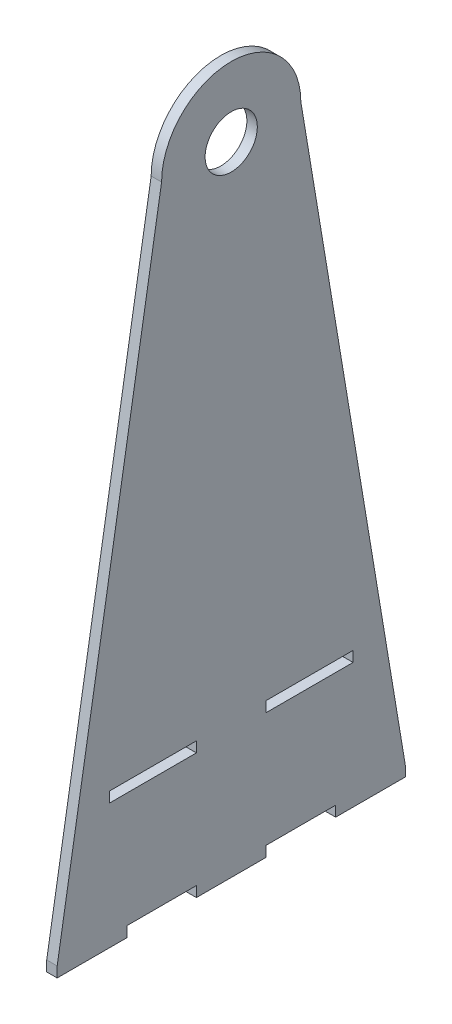
ISO-10303-21;
HEADER;
FILE_DESCRIPTION(('STEP AP214'),'2;1');
FILE_NAME('part.step','',(''),(''),'','','');
FILE_SCHEMA(('AUTOMOTIVE_DESIGN { 1 0 10303 214 1 1 1 1 }'));
ENDSEC;
DATA;
#1=APPLICATION_CONTEXT('core data for automotive mechanical design processes');
#2=APPLICATION_PROTOCOL_DEFINITION('international standard','automotive_design',2000,#1);
#3=PRODUCT_CONTEXT('',#1,'mechanical');
#4=PRODUCT('Part','Part','',(#3));
#5=PRODUCT_RELATED_PRODUCT_CATEGORY('part','',(#4));
#6=PRODUCT_DEFINITION_FORMATION('','',#4);
#7=PRODUCT_DEFINITION_CONTEXT('part definition',#1,'design');
#8=PRODUCT_DEFINITION('design','',#6,#7);
#9=PRODUCT_DEFINITION_SHAPE('','',#8);
#10=(LENGTH_UNIT() NAMED_UNIT(*) SI_UNIT(.MILLI.,.METRE.));
#11=(NAMED_UNIT(*) PLANE_ANGLE_UNIT() SI_UNIT($,.RADIAN.));
#12=(NAMED_UNIT(*) SI_UNIT($,.STERADIAN.) SOLID_ANGLE_UNIT());
#13=UNCERTAINTY_MEASURE_WITH_UNIT(LENGTH_MEASURE(1.E-05),#10,'distance_accuracy_value','');
#14=(GEOMETRIC_REPRESENTATION_CONTEXT(3) GLOBAL_UNCERTAINTY_ASSIGNED_CONTEXT((#13)) GLOBAL_UNIT_ASSIGNED_CONTEXT((#10,
#11,#12)) REPRESENTATION_CONTEXT('',''));
#15=CARTESIAN_POINT('',(0.,0.,0.));
#16=DIRECTION('',(0.,0.,1.));
#17=DIRECTION('',(1.,0.,0.));
#18=AXIS2_PLACEMENT_3D('',#15,#16,#17);
#19=CARTESIAN_POINT('',(1.5,0.,-50.));
#20=DIRECTION('',(0.,1.,0.));
#21=DIRECTION('',(0.,0.,1.));
#22=AXIS2_PLACEMENT_3D('',#19,#20,#21);
#23=PLANE('',#22);
#24=DIRECTION('',(1.,0.,0.));
#25=VECTOR('',#24,1.);
#26=CARTESIAN_POINT('',(-1.5,0.,30.));
#27=LINE('',#26,#25);
#28=CARTESIAN_POINT('',(-1.5,0.,30.));
#29=VERTEX_POINT('',#28);
#30=CARTESIAN_POINT('',(1.5,0.,30.));
#31=VERTEX_POINT('',#30);
#32=EDGE_CURVE('E54',#29,#31,#27,.T.);
#33=ORIENTED_EDGE('',*,*,#32,.F.);
#34=DIRECTION('',(0.,0.,-1.));
#35=VECTOR('',#34,1.);
#36=CARTESIAN_POINT('',(-1.5,0.,-50.));
#37=LINE('',#36,#35);
#38=CARTESIAN_POINT('',(-1.5,0.,10.));
#39=VERTEX_POINT('',#38);
#40=EDGE_CURVE('E215',#29,#39,#37,.T.);
#41=ORIENTED_EDGE('',*,*,#40,.T.);
#42=DIRECTION('',(-1.,0.,0.));
#43=VECTOR('',#42,1.);
#44=CARTESIAN_POINT('',(0.,0.,10.));
#45=LINE('',#44,#43);
#46=CARTESIAN_POINT('',(1.5,0.,10.));
#47=VERTEX_POINT('',#46);
#48=EDGE_CURVE('E311',#47,#39,#45,.T.);
#49=ORIENTED_EDGE('',*,*,#48,.F.);
#50=DIRECTION('',(0.,0.,-1.));
#51=VECTOR('',#50,1.);
#52=CARTESIAN_POINT('',(1.5,0.,-50.));
#53=LINE('',#52,#51);
#54=EDGE_CURVE('E50',#31,#47,#53,.T.);
#55=ORIENTED_EDGE('',*,*,#54,.F.);
#56=EDGE_LOOP('',(#33,#41,#49,#55));
#57=FACE_BOUND('',#56,.T.);
#58=ADVANCED_FACE('F35',(#57),#23,.F.);
#59=DIRECTION('',(-1.,0.,0.));
#60=VECTOR('',#59,1.);
#61=CARTESIAN_POINT('',(0.,0.,-30.));
#62=LINE('',#61,#60);
#63=CARTESIAN_POINT('',(1.5,0.,-30.));
#64=VERTEX_POINT('',#63);
#65=CARTESIAN_POINT('',(-1.5,0.,-30.));
#66=VERTEX_POINT('',#65);
#67=EDGE_CURVE('E314',#64,#66,#62,.T.);
#68=ORIENTED_EDGE('',*,*,#67,.F.);
#69=CARTESIAN_POINT('',(1.5,0.,-9.99999999999999));
#70=VERTEX_POINT('',#69);
#71=EDGE_CURVE('E224',#70,#64,#53,.T.);
#72=ORIENTED_EDGE('',*,*,#71,.F.);
#73=DIRECTION('',(1.,0.,0.));
#74=VECTOR('',#73,1.);
#75=CARTESIAN_POINT('',(0.,0.,-10.));
#76=LINE('',#75,#74);
#77=CARTESIAN_POINT('',(-1.5,0.,-9.99999999999999));
#78=VERTEX_POINT('',#77);
#79=EDGE_CURVE('E307',#78,#70,#76,.T.);
#80=ORIENTED_EDGE('',*,*,#79,.F.);
#81=EDGE_CURVE('E192',#78,#66,#37,.T.);
#82=ORIENTED_EDGE('',*,*,#81,.T.);
#83=EDGE_LOOP('',(#68,#72,#80,#82));
#84=FACE_BOUND('',#83,.T.);
#85=ADVANCED_FACE('F379',(#84),#23,.F.);
#86=CARTESIAN_POINT('',(1.5,180.,0.));
#87=DIRECTION('',(1.,0.,0.));
#88=DIRECTION('',(0.,0.,-1.));
#89=AXIS2_PLACEMENT_3D('',#86,#87,#88);
#90=PLANE('',#89);
#91=DIRECTION('',(0.,-1.,0.));
#92=VECTOR('',#91,1.);
#93=CARTESIAN_POINT('',(1.5,180.,-10.));
#94=LINE('',#93,#92);
#95=CARTESIAN_POINT('',(1.5,36.,-10.));
#96=VERTEX_POINT('',#95);
#97=CARTESIAN_POINT('',(1.5,33.,-10.));
#98=VERTEX_POINT('',#97);
#99=EDGE_CURVE('E234',#96,#98,#94,.T.);
#100=ORIENTED_EDGE('',*,*,#99,.F.);
#101=DIRECTION('',(0.,0.,1.));
#102=VECTOR('',#101,1.);
#103=CARTESIAN_POINT('',(1.5,36.,0.));
#104=LINE('',#103,#102);
#105=CARTESIAN_POINT('',(1.5,36.,-35.));
#106=VERTEX_POINT('',#105);
#107=EDGE_CURVE('E243',#106,#96,#104,.T.);
#108=ORIENTED_EDGE('',*,*,#107,.F.);
#109=DIRECTION('',(0.,1.,0.));
#110=VECTOR('',#109,1.);
#111=CARTESIAN_POINT('',(1.5,180.,-35.));
#112=LINE('',#111,#110);
#113=CARTESIAN_POINT('',(1.5,33.,-35.));
#114=VERTEX_POINT('',#113);
#115=EDGE_CURVE('E240',#114,#106,#112,.T.);
#116=ORIENTED_EDGE('',*,*,#115,.F.);
#117=DIRECTION('',(0.,0.,-1.));
#118=VECTOR('',#117,1.);
#119=CARTESIAN_POINT('',(1.5,33.,0.));
#120=LINE('',#119,#118);
#121=EDGE_CURVE('E238',#98,#114,#120,.T.);
#122=ORIENTED_EDGE('',*,*,#121,.F.);
#123=EDGE_LOOP('',(#100,#108,#116,#122));
#124=FACE_BOUND('',#123,.T.);
#125=DIRECTION('',(0.,0.,1.));
#126=VECTOR('',#125,1.);
#127=CARTESIAN_POINT('',(1.5,36.,0.));
#128=LINE('',#127,#126);
#129=CARTESIAN_POINT('',(1.5,36.,10.));
#130=VERTEX_POINT('',#129);
#131=CARTESIAN_POINT('',(1.5,36.,35.));
#132=VERTEX_POINT('',#131);
#133=EDGE_CURVE('E245',#130,#132,#128,.T.);
#134=ORIENTED_EDGE('',*,*,#133,.F.);
#135=DIRECTION('',(0.,1.,0.));
#136=VECTOR('',#135,1.);
#137=CARTESIAN_POINT('',(1.5,180.,10.));
#138=LINE('',#137,#136);
#139=CARTESIAN_POINT('',(1.5,33.,10.));
#140=VERTEX_POINT('',#139);
#141=EDGE_CURVE('E252',#140,#130,#138,.T.);
#142=ORIENTED_EDGE('',*,*,#141,.F.);
#143=DIRECTION('',(0.,0.,-1.));
#144=VECTOR('',#143,1.);
#145=CARTESIAN_POINT('',(1.5,33.,0.));
#146=LINE('',#145,#144);
#147=CARTESIAN_POINT('',(1.5,33.,35.));
#148=VERTEX_POINT('',#147);
#149=EDGE_CURVE('E249',#148,#140,#146,.T.);
#150=ORIENTED_EDGE('',*,*,#149,.F.);
#151=DIRECTION('',(0.,-1.,0.));
#152=VECTOR('',#151,1.);
#153=CARTESIAN_POINT('',(1.5,180.,35.));
#154=LINE('',#153,#152);
#155=EDGE_CURVE('E247',#132,#148,#154,.T.);
#156=ORIENTED_EDGE('',*,*,#155,.F.);
#157=EDGE_LOOP('',(#134,#142,#150,#156));
#158=FACE_BOUND('',#157,.T.);
#159=DIRECTION('',(0.,0.986393923832144,0.164398987305357));
#160=VECTOR('',#159,1.);
#161=CARTESIAN_POINT('',(1.5,0.,-50.));
#162=LINE('',#161,#160);
#163=CARTESIAN_POINT('',(1.5,0.,-50.));
#164=VERTEX_POINT('',#163);
#165=CARTESIAN_POINT('',(1.5,180.,-20.));
#166=VERTEX_POINT('',#165);
#167=EDGE_CURVE('E216',#164,#166,#162,.T.);
#168=ORIENTED_EDGE('',*,*,#167,.T.);
#169=CARTESIAN_POINT('',(1.5,180.,0.));
#170=DIRECTION('',(1.,0.,0.));
#171=DIRECTION('',(0.,0.,-1.));
#172=AXIS2_PLACEMENT_3D('',#169,#170,#171);
#173=CIRCLE('',#172,20.);
#174=CARTESIAN_POINT('',(1.5,180.,20.));
#175=VERTEX_POINT('',#174);
#176=EDGE_CURVE('E227',#166,#175,#173,.T.);
#177=ORIENTED_EDGE('',*,*,#176,.T.);
#178=DIRECTION('',(0.,-0.986393923832144,0.164398987305357));
#179=VECTOR('',#178,1.);
#180=CARTESIAN_POINT('',(1.5,0.,50.));
#181=LINE('',#180,#179);
#182=CARTESIAN_POINT('',(1.5,0.,50.));
#183=VERTEX_POINT('',#182);
#184=EDGE_CURVE('E225',#175,#183,#181,.T.);
#185=ORIENTED_EDGE('',*,*,#184,.T.);
#186=DIRECTION('',(0.,1.,0.));
#187=VECTOR('',#186,1.);
#188=CARTESIAN_POINT('',(1.5,-3.00000000000001,50.));
#189=LINE('',#188,#187);
#190=CARTESIAN_POINT('',(1.5,-3.00000000000001,50.));
#191=VERTEX_POINT('',#190);
#192=EDGE_CURVE('E209',#191,#183,#189,.T.);
#193=ORIENTED_EDGE('',*,*,#192,.F.);
#194=DIRECTION('',(0.,0.,1.));
#195=VECTOR('',#194,1.);
#196=CARTESIAN_POINT('',(1.5,-3.,30.));
#197=LINE('',#196,#195);
#198=CARTESIAN_POINT('',(1.5,-3.,30.));
#199=VERTEX_POINT('',#198);
#200=EDGE_CURVE('E347',#199,#191,#197,.T.);
#201=ORIENTED_EDGE('',*,*,#200,.F.);
#202=DIRECTION('',(0.,1.,0.));
#203=VECTOR('',#202,1.);
#204=CARTESIAN_POINT('',(1.5,-3.,30.));
#205=LINE('',#204,#203);
#206=EDGE_CURVE('E351',#199,#31,#205,.T.);
#207=ORIENTED_EDGE('',*,*,#206,.T.);
#208=ORIENTED_EDGE('',*,*,#54,.T.);
#209=DIRECTION('',(0.,1.,0.));
#210=VECTOR('',#209,1.);
#211=CARTESIAN_POINT('',(1.5,-3.,10.));
#212=LINE('',#211,#210);
#213=CARTESIAN_POINT('',(1.5,-3.,10.));
#214=VERTEX_POINT('',#213);
#215=EDGE_CURVE('E276',#214,#47,#212,.T.);
#216=ORIENTED_EDGE('',*,*,#215,.F.);
#217=DIRECTION('',(0.,0.,1.));
#218=VECTOR('',#217,1.);
#219=CARTESIAN_POINT('',(1.5,-3.,0.));
#220=LINE('',#219,#218);
#221=CARTESIAN_POINT('',(1.5,-3.,-10.));
#222=VERTEX_POINT('',#221);
#223=EDGE_CURVE('E310',#222,#214,#220,.T.);
#224=ORIENTED_EDGE('',*,*,#223,.F.);
#225=DIRECTION('',(0.,1.,0.));
#226=VECTOR('',#225,1.);
#227=CARTESIAN_POINT('',(1.5,-3.,-10.));
#228=LINE('',#227,#226);
#229=EDGE_CURVE('E303',#222,#70,#228,.T.);
#230=ORIENTED_EDGE('',*,*,#229,.T.);
#231=ORIENTED_EDGE('',*,*,#71,.T.);
#232=DIRECTION('',(0.,1.,0.));
#233=VECTOR('',#232,1.);
#234=CARTESIAN_POINT('',(1.5,-3.,-30.));
#235=LINE('',#234,#233);
#236=CARTESIAN_POINT('',(1.5,-3.,-30.));
#237=VERTEX_POINT('',#236);
#238=EDGE_CURVE('E340',#237,#64,#235,.T.);
#239=ORIENTED_EDGE('',*,*,#238,.F.);
#240=DIRECTION('',(0.,0.,1.));
#241=VECTOR('',#240,1.);
#242=CARTESIAN_POINT('',(1.5,-3.,0.));
#243=LINE('',#242,#241);
#244=CARTESIAN_POINT('',(1.5,-2.99999999999999,-50.));
#245=VERTEX_POINT('',#244);
#246=EDGE_CURVE('E322',#245,#237,#243,.T.);
#247=ORIENTED_EDGE('',*,*,#246,.F.);
#248=DIRECTION('',(0.,1.,0.));
#249=VECTOR('',#248,1.);
#250=CARTESIAN_POINT('',(1.5,-2.99999999999999,-50.));
#251=LINE('',#250,#249);
#252=EDGE_CURVE('E331',#245,#164,#251,.T.);
#253=ORIENTED_EDGE('',*,*,#252,.T.);
#254=EDGE_LOOP('',(#168,#177,#185,#193,#201,#207,#208,#216,#224,#230,#231,#239,#247,#253));
#255=FACE_BOUND('',#254,.T.);
#256=CARTESIAN_POINT('',(1.5,180.,0.));
#257=DIRECTION('',(1.,0.,0.));
#258=DIRECTION('',(0.,0.,-1.));
#259=AXIS2_PLACEMENT_3D('',#256,#257,#258);
#260=CIRCLE('',#259,7.5);
#261=CARTESIAN_POINT('',(1.5,180.,-7.5));
#262=VERTEX_POINT('',#261);
#263=EDGE_CURVE('E222',#262,#262,#260,.T.);
#264=ORIENTED_EDGE('',*,*,#263,.F.);
#265=EDGE_LOOP('',(#264));
#266=FACE_BOUND('',#265,.T.);
#267=ADVANCED_FACE('F366',(#124,#158,#255,#266),#90,.T.);
#268=CARTESIAN_POINT('',(-1.5,180.,0.));
#269=DIRECTION('',(1.,0.,0.));
#270=DIRECTION('',(0.,0.,-1.));
#271=AXIS2_PLACEMENT_3D('',#268,#269,#270);
#272=PLANE('',#271);
#273=DIRECTION('',(0.,0.,-1.));
#274=VECTOR('',#273,1.);
#275=CARTESIAN_POINT('',(-1.5,36.,-10.));
#276=LINE('',#275,#274);
#277=CARTESIAN_POINT('',(-1.5,36.,-10.));
#278=VERTEX_POINT('',#277);
#279=CARTESIAN_POINT('',(-1.5,36.,-35.));
#280=VERTEX_POINT('',#279);
#281=EDGE_CURVE('E291',#278,#280,#276,.T.);
#282=ORIENTED_EDGE('',*,*,#281,.F.);
#283=DIRECTION('',(0.,1.,0.));
#284=VECTOR('',#283,1.);
#285=CARTESIAN_POINT('',(-1.5,36.,-10.));
#286=LINE('',#285,#284);
#287=CARTESIAN_POINT('',(-1.5,33.,-10.));
#288=VERTEX_POINT('',#287);
#289=EDGE_CURVE('E265',#288,#278,#286,.T.);
#290=ORIENTED_EDGE('',*,*,#289,.F.);
#291=DIRECTION('',(0.,0.,1.));
#292=VECTOR('',#291,1.);
#293=CARTESIAN_POINT('',(-1.5,33.,-10.));
#294=LINE('',#293,#292);
#295=CARTESIAN_POINT('',(-1.5,33.,-35.));
#296=VERTEX_POINT('',#295);
#297=EDGE_CURVE('E281',#296,#288,#294,.T.);
#298=ORIENTED_EDGE('',*,*,#297,.F.);
#299=DIRECTION('',(0.,-1.,0.));
#300=VECTOR('',#299,1.);
#301=CARTESIAN_POINT('',(-1.5,36.,-35.));
#302=LINE('',#301,#300);
#303=EDGE_CURVE('E288',#280,#296,#302,.T.);
#304=ORIENTED_EDGE('',*,*,#303,.F.);
#305=EDGE_LOOP('',(#282,#290,#298,#304));
#306=FACE_BOUND('',#305,.T.);
#307=DIRECTION('',(0.,-1.,0.));
#308=VECTOR('',#307,1.);
#309=CARTESIAN_POINT('',(-1.5,36.,10.));
#310=LINE('',#309,#308);
#311=CARTESIAN_POINT('',(-1.5,36.,10.));
#312=VERTEX_POINT('',#311);
#313=CARTESIAN_POINT('',(-1.5,33.,10.));
#314=VERTEX_POINT('',#313);
#315=EDGE_CURVE('E271',#312,#314,#310,.T.);
#316=ORIENTED_EDGE('',*,*,#315,.F.);
#317=DIRECTION('',(0.,0.,-1.));
#318=VECTOR('',#317,1.);
#319=CARTESIAN_POINT('',(-1.5,36.,10.));
#320=LINE('',#319,#318);
#321=CARTESIAN_POINT('',(-1.5,36.,35.));
#322=VERTEX_POINT('',#321);
#323=EDGE_CURVE('E274',#322,#312,#320,.T.);
#324=ORIENTED_EDGE('',*,*,#323,.F.);
#325=DIRECTION('',(0.,1.,0.));
#326=VECTOR('',#325,1.);
#327=CARTESIAN_POINT('',(-1.5,36.,35.));
#328=LINE('',#327,#326);
#329=CARTESIAN_POINT('',(-1.5,33.,35.));
#330=VERTEX_POINT('',#329);
#331=EDGE_CURVE('E259',#330,#322,#328,.T.);
#332=ORIENTED_EDGE('',*,*,#331,.F.);
#333=DIRECTION('',(0.,0.,1.));
#334=VECTOR('',#333,1.);
#335=CARTESIAN_POINT('',(-1.5,33.,10.));
#336=LINE('',#335,#334);
#337=EDGE_CURVE('E268',#314,#330,#336,.T.);
#338=ORIENTED_EDGE('',*,*,#337,.F.);
#339=EDGE_LOOP('',(#316,#324,#332,#338));
#340=FACE_BOUND('',#339,.T.);
#341=DIRECTION('',(0.,0.986393923832144,0.164398987305357));
#342=VECTOR('',#341,1.);
#343=CARTESIAN_POINT('',(-1.5,0.,-50.));
#344=LINE('',#343,#342);
#345=CARTESIAN_POINT('',(-1.5,0.,-50.));
#346=VERTEX_POINT('',#345);
#347=CARTESIAN_POINT('',(-1.5,180.,-20.));
#348=VERTEX_POINT('',#347);
#349=EDGE_CURVE('E219',#346,#348,#344,.T.);
#350=ORIENTED_EDGE('',*,*,#349,.F.);
#351=DIRECTION('',(0.,1.,0.));
#352=VECTOR('',#351,1.);
#353=CARTESIAN_POINT('',(-1.5,-2.99999999999999,-50.));
#354=LINE('',#353,#352);
#355=CARTESIAN_POINT('',(-1.5,-2.99999999999999,-50.));
#356=VERTEX_POINT('',#355);
#357=EDGE_CURVE('E335',#356,#346,#354,.T.);
#358=ORIENTED_EDGE('',*,*,#357,.F.);
#359=DIRECTION('',(0.,0.,-1.));
#360=VECTOR('',#359,1.);
#361=CARTESIAN_POINT('',(-1.5,-3.,0.));
#362=LINE('',#361,#360);
#363=CARTESIAN_POINT('',(-1.5,-3.,-30.));
#364=VERTEX_POINT('',#363);
#365=EDGE_CURVE('E327',#364,#356,#362,.T.);
#366=ORIENTED_EDGE('',*,*,#365,.F.);
#367=DIRECTION('',(0.,1.,0.));
#368=VECTOR('',#367,1.);
#369=CARTESIAN_POINT('',(-1.5,-3.,-30.));
#370=LINE('',#369,#368);
#371=EDGE_CURVE('E337',#364,#66,#370,.T.);
#372=ORIENTED_EDGE('',*,*,#371,.T.);
#373=ORIENTED_EDGE('',*,*,#81,.F.);
#374=DIRECTION('',(0.,1.,0.));
#375=VECTOR('',#374,1.);
#376=CARTESIAN_POINT('',(-1.5,-3.,-10.));
#377=LINE('',#376,#375);
#378=CARTESIAN_POINT('',(-1.5,-3.,-10.));
#379=VERTEX_POINT('',#378);
#380=EDGE_CURVE('E300',#379,#78,#377,.T.);
#381=ORIENTED_EDGE('',*,*,#380,.F.);
#382=DIRECTION('',(0.,0.,-1.));
#383=VECTOR('',#382,1.);
#384=CARTESIAN_POINT('',(-1.5,-3.,0.));
#385=LINE('',#384,#383);
#386=CARTESIAN_POINT('',(-1.5,-3.,10.));
#387=VERTEX_POINT('',#386);
#388=EDGE_CURVE('E316',#387,#379,#385,.T.);
#389=ORIENTED_EDGE('',*,*,#388,.F.);
#390=DIRECTION('',(0.,1.,0.));
#391=VECTOR('',#390,1.);
#392=CARTESIAN_POINT('',(-1.5,-3.,10.));
#393=LINE('',#392,#391);
#394=EDGE_CURVE('E297',#387,#39,#393,.T.);
#395=ORIENTED_EDGE('',*,*,#394,.T.);
#396=ORIENTED_EDGE('',*,*,#40,.F.);
#397=DIRECTION('',(0.,1.,0.));
#398=VECTOR('',#397,1.);
#399=CARTESIAN_POINT('',(-1.5,-3.,30.));
#400=LINE('',#399,#398);
#401=CARTESIAN_POINT('',(-1.5,-3.,30.));
#402=VERTEX_POINT('',#401);
#403=EDGE_CURVE('E205',#402,#29,#400,.T.);
#404=ORIENTED_EDGE('',*,*,#403,.F.);
#405=DIRECTION('',(0.,0.,-1.));
#406=VECTOR('',#405,1.);
#407=CARTESIAN_POINT('',(-1.5,-3.00000000000001,50.));
#408=LINE('',#407,#406);
#409=CARTESIAN_POINT('',(-1.5,-3.00000000000001,50.));
#410=VERTEX_POINT('',#409);
#411=EDGE_CURVE('E201',#410,#402,#408,.T.);
#412=ORIENTED_EDGE('',*,*,#411,.F.);
#413=DIRECTION('',(0.,1.,0.));
#414=VECTOR('',#413,1.);
#415=CARTESIAN_POINT('',(-1.5,-3.00000000000001,50.));
#416=LINE('',#415,#414);
#417=CARTESIAN_POINT('',(-1.5,0.,50.));
#418=VERTEX_POINT('',#417);
#419=EDGE_CURVE('E196',#410,#418,#416,.T.);
#420=ORIENTED_EDGE('',*,*,#419,.T.);
#421=DIRECTION('',(0.,-0.986393923832144,0.164398987305357));
#422=VECTOR('',#421,1.);
#423=CARTESIAN_POINT('',(-1.5,0.,50.));
#424=LINE('',#423,#422);
#425=CARTESIAN_POINT('',(-1.5,180.,20.));
#426=VERTEX_POINT('',#425);
#427=EDGE_CURVE('E183',#426,#418,#424,.T.);
#428=ORIENTED_EDGE('',*,*,#427,.F.);
#429=CARTESIAN_POINT('',(-1.5,180.,0.));
#430=DIRECTION('',(1.,0.,0.));
#431=DIRECTION('',(0.,0.,-1.));
#432=AXIS2_PLACEMENT_3D('',#429,#430,#431);
#433=CIRCLE('',#432,20.);
#434=EDGE_CURVE('E193',#348,#426,#433,.T.);
#435=ORIENTED_EDGE('',*,*,#434,.F.);
#436=EDGE_LOOP('',(#350,#358,#366,#372,#373,#381,#389,#395,#396,#404,#412,#420,#428,#435));
#437=FACE_BOUND('',#436,.T.);
#438=CARTESIAN_POINT('',(-1.5,180.,0.));
#439=DIRECTION('',(1.,0.,0.));
#440=DIRECTION('',(0.,0.,-1.));
#441=AXIS2_PLACEMENT_3D('',#438,#439,#440);
#442=CIRCLE('',#441,7.5);
#443=CARTESIAN_POINT('',(-1.5,180.,-7.5));
#444=VERTEX_POINT('',#443);
#445=EDGE_CURVE('E231',#444,#444,#442,.T.);
#446=ORIENTED_EDGE('',*,*,#445,.T.);
#447=EDGE_LOOP('',(#446));
#448=FACE_BOUND('',#447,.T.);
#449=ADVANCED_FACE('F198',(#306,#340,#437,#448),#272,.F.);
#450=CARTESIAN_POINT('',(1.5,0.,-50.));
#451=DIRECTION('',(0.,-0.164398987305357,0.986393923832144));
#452=DIRECTION('',(0.,-0.986393923832144,-0.164398987305357));
#453=AXIS2_PLACEMENT_3D('',#450,#451,#452);
#454=PLANE('',#453);
#455=ORIENTED_EDGE('',*,*,#349,.T.);
#456=DIRECTION('',(-1.,0.,0.));
#457=VECTOR('',#456,1.);
#458=CARTESIAN_POINT('',(1.5,180.,-20.));
#459=LINE('',#458,#457);
#460=EDGE_CURVE('E11',#166,#348,#459,.T.);
#461=ORIENTED_EDGE('',*,*,#460,.F.);
#462=ORIENTED_EDGE('',*,*,#167,.F.);
#463=DIRECTION('',(-1.,0.,0.));
#464=VECTOR('',#463,1.);
#465=CARTESIAN_POINT('',(1.5,0.,-50.));
#466=LINE('',#465,#464);
#467=EDGE_CURVE('E210',#164,#346,#466,.T.);
#468=ORIENTED_EDGE('',*,*,#467,.T.);
#469=EDGE_LOOP('',(#455,#461,#462,#468));
#470=FACE_BOUND('',#469,.T.);
#471=ADVANCED_FACE('F37',(#470),#454,.F.);
#472=CARTESIAN_POINT('',(1.5,180.,0.));
#473=DIRECTION('',(-1.,0.,0.));
#474=DIRECTION('',(0.,0.,1.));
#475=AXIS2_PLACEMENT_3D('',#472,#473,#474);
#476=CYLINDRICAL_SURFACE('',#475,20.);
#477=ORIENTED_EDGE('',*,*,#434,.T.);
#478=DIRECTION('',(-1.,0.,0.));
#479=VECTOR('',#478,1.);
#480=CARTESIAN_POINT('',(1.5,180.,20.));
#481=LINE('',#480,#479);
#482=EDGE_CURVE('E43',#175,#426,#481,.T.);
#483=ORIENTED_EDGE('',*,*,#482,.F.);
#484=ORIENTED_EDGE('',*,*,#176,.F.);
#485=ORIENTED_EDGE('',*,*,#460,.T.);
#486=EDGE_LOOP('',(#477,#483,#484,#485));
#487=FACE_BOUND('',#486,.T.);
#488=ADVANCED_FACE('F390',(#487),#476,.T.);
#489=CARTESIAN_POINT('',(1.5,0.,50.));
#490=DIRECTION('',(0.,-0.164398987305357,-0.986393923832144));
#491=DIRECTION('',(0.,0.986393923832144,-0.164398987305357));
#492=AXIS2_PLACEMENT_3D('',#489,#490,#491);
#493=PLANE('',#492);
#494=ORIENTED_EDGE('',*,*,#427,.T.);
#495=DIRECTION('',(-1.,0.,0.));
#496=VECTOR('',#495,1.);
#497=CARTESIAN_POINT('',(1.5,0.,50.));
#498=LINE('',#497,#496);
#499=EDGE_CURVE('E188',#183,#418,#498,.T.);
#500=ORIENTED_EDGE('',*,*,#499,.F.);
#501=ORIENTED_EDGE('',*,*,#184,.F.);
#502=ORIENTED_EDGE('',*,*,#482,.T.);
#503=EDGE_LOOP('',(#494,#500,#501,#502));
#504=FACE_BOUND('',#503,.T.);
#505=ADVANCED_FACE('F185',(#504),#493,.F.);
#506=CARTESIAN_POINT('',(1.5,180.,0.));
#507=DIRECTION('',(-1.,0.,0.));
#508=DIRECTION('',(0.,0.,1.));
#509=AXIS2_PLACEMENT_3D('',#506,#507,#508);
#510=CYLINDRICAL_SURFACE('',#509,7.5);
#511=ORIENTED_EDGE('',*,*,#263,.T.);
#512=EDGE_LOOP('',(#511));
#513=FACE_BOUND('',#512,.T.);
#514=ORIENTED_EDGE('',*,*,#445,.F.);
#515=EDGE_LOOP('',(#514));
#516=FACE_BOUND('',#515,.T.);
#517=ADVANCED_FACE('F389',(#513,#516),#510,.F.);
#518=CARTESIAN_POINT('',(2.5,36.,10.));
#519=DIRECTION('',(0.,1.,0.));
#520=DIRECTION('',(0.,0.,1.));
#521=AXIS2_PLACEMENT_3D('',#518,#519,#520);
#522=PLANE('',#521);
#523=ORIENTED_EDGE('',*,*,#133,.T.);
#524=DIRECTION('',(-1.,0.,0.));
#525=VECTOR('',#524,1.);
#526=CARTESIAN_POINT('',(2.5,36.,35.));
#527=LINE('',#526,#525);
#528=EDGE_CURVE('E263',#132,#322,#527,.T.);
#529=ORIENTED_EDGE('',*,*,#528,.T.);
#530=ORIENTED_EDGE('',*,*,#323,.T.);
#531=DIRECTION('',(-1.,0.,0.));
#532=VECTOR('',#531,1.);
#533=CARTESIAN_POINT('',(2.5,36.,10.));
#534=LINE('',#533,#532);
#535=EDGE_CURVE('E255',#130,#312,#534,.T.);
#536=ORIENTED_EDGE('',*,*,#535,.F.);
#537=EDGE_LOOP('',(#523,#529,#530,#536));
#538=FACE_BOUND('',#537,.T.);
#539=ADVANCED_FACE('F456',(#538),#522,.F.);
#540=CARTESIAN_POINT('',(2.5,36.,35.));
#541=DIRECTION('',(0.,0.,1.));
#542=DIRECTION('',(1.,0.,0.));
#543=AXIS2_PLACEMENT_3D('',#540,#541,#542);
#544=PLANE('',#543);
#545=ORIENTED_EDGE('',*,*,#155,.T.);
#546=DIRECTION('',(-1.,0.,0.));
#547=VECTOR('',#546,1.);
#548=CARTESIAN_POINT('',(2.5,33.,35.));
#549=LINE('',#548,#547);
#550=EDGE_CURVE('E261',#148,#330,#549,.T.);
#551=ORIENTED_EDGE('',*,*,#550,.T.);
#552=ORIENTED_EDGE('',*,*,#331,.T.);
#553=ORIENTED_EDGE('',*,*,#528,.F.);
#554=EDGE_LOOP('',(#545,#551,#552,#553));
#555=FACE_BOUND('',#554,.T.);
#556=ADVANCED_FACE('F452',(#555),#544,.F.);
#557=CARTESIAN_POINT('',(2.5,33.,10.));
#558=DIRECTION('',(0.,-1.,0.));
#559=DIRECTION('',(0.,0.,-1.));
#560=AXIS2_PLACEMENT_3D('',#557,#558,#559);
#561=PLANE('',#560);
#562=ORIENTED_EDGE('',*,*,#149,.T.);
#563=DIRECTION('',(-1.,0.,0.));
#564=VECTOR('',#563,1.);
#565=CARTESIAN_POINT('',(2.5,33.,10.));
#566=LINE('',#565,#564);
#567=EDGE_CURVE('E258',#140,#314,#566,.T.);
#568=ORIENTED_EDGE('',*,*,#567,.T.);
#569=ORIENTED_EDGE('',*,*,#337,.T.);
#570=ORIENTED_EDGE('',*,*,#550,.F.);
#571=EDGE_LOOP('',(#562,#568,#569,#570));
#572=FACE_BOUND('',#571,.T.);
#573=ADVANCED_FACE('F455',(#572),#561,.F.);
#574=CARTESIAN_POINT('',(2.5,36.,10.));
#575=DIRECTION('',(0.,0.,-1.));
#576=DIRECTION('',(-1.,0.,0.));
#577=AXIS2_PLACEMENT_3D('',#574,#575,#576);
#578=PLANE('',#577);
#579=ORIENTED_EDGE('',*,*,#141,.T.);
#580=ORIENTED_EDGE('',*,*,#535,.T.);
#581=ORIENTED_EDGE('',*,*,#315,.T.);
#582=ORIENTED_EDGE('',*,*,#567,.F.);
#583=EDGE_LOOP('',(#579,#580,#581,#582));
#584=FACE_BOUND('',#583,.T.);
#585=ADVANCED_FACE('F450',(#584),#578,.F.);
#586=CARTESIAN_POINT('',(2.5,36.,-10.));
#587=DIRECTION('',(0.,0.,1.));
#588=DIRECTION('',(1.,0.,0.));
#589=AXIS2_PLACEMENT_3D('',#586,#587,#588);
#590=PLANE('',#589);
#591=ORIENTED_EDGE('',*,*,#99,.T.);
#592=DIRECTION('',(-1.,0.,0.));
#593=VECTOR('',#592,1.);
#594=CARTESIAN_POINT('',(2.5,33.,-10.));
#595=LINE('',#594,#593);
#596=EDGE_CURVE('E254',#98,#288,#595,.T.);
#597=ORIENTED_EDGE('',*,*,#596,.T.);
#598=ORIENTED_EDGE('',*,*,#289,.T.);
#599=DIRECTION('',(-1.,0.,0.));
#600=VECTOR('',#599,1.);
#601=CARTESIAN_POINT('',(2.5,36.,-10.));
#602=LINE('',#601,#600);
#603=EDGE_CURVE('E277',#96,#278,#602,.T.);
#604=ORIENTED_EDGE('',*,*,#603,.F.);
#605=EDGE_LOOP('',(#591,#597,#598,#604));
#606=FACE_BOUND('',#605,.T.);
#607=ADVANCED_FACE('F440',(#606),#590,.F.);
#608=CARTESIAN_POINT('',(2.5,33.,-10.));
#609=DIRECTION('',(0.,-1.,0.));
#610=DIRECTION('',(0.,0.,-1.));
#611=AXIS2_PLACEMENT_3D('',#608,#609,#610);
#612=PLANE('',#611);
#613=ORIENTED_EDGE('',*,*,#121,.T.);
#614=DIRECTION('',(-1.,0.,0.));
#615=VECTOR('',#614,1.);
#616=CARTESIAN_POINT('',(2.5,33.,-35.));
#617=LINE('',#616,#615);
#618=EDGE_CURVE('E283',#114,#296,#617,.T.);
#619=ORIENTED_EDGE('',*,*,#618,.T.);
#620=ORIENTED_EDGE('',*,*,#297,.T.);
#621=ORIENTED_EDGE('',*,*,#596,.F.);
#622=EDGE_LOOP('',(#613,#619,#620,#621));
#623=FACE_BOUND('',#622,.T.);
#624=ADVANCED_FACE('F436',(#623),#612,.F.);
#625=CARTESIAN_POINT('',(2.5,36.,-35.));
#626=DIRECTION('',(0.,0.,-1.));
#627=DIRECTION('',(-1.,0.,0.));
#628=AXIS2_PLACEMENT_3D('',#625,#626,#627);
#629=PLANE('',#628);
#630=ORIENTED_EDGE('',*,*,#115,.T.);
#631=DIRECTION('',(-1.,0.,0.));
#632=VECTOR('',#631,1.);
#633=CARTESIAN_POINT('',(2.5,36.,-35.));
#634=LINE('',#633,#632);
#635=EDGE_CURVE('E280',#106,#280,#634,.T.);
#636=ORIENTED_EDGE('',*,*,#635,.T.);
#637=ORIENTED_EDGE('',*,*,#303,.T.);
#638=ORIENTED_EDGE('',*,*,#618,.F.);
#639=EDGE_LOOP('',(#630,#636,#637,#638));
#640=FACE_BOUND('',#639,.T.);
#641=ADVANCED_FACE('F439',(#640),#629,.F.);
#642=CARTESIAN_POINT('',(2.5,36.,-10.));
#643=DIRECTION('',(0.,1.,0.));
#644=DIRECTION('',(0.,0.,1.));
#645=AXIS2_PLACEMENT_3D('',#642,#643,#644);
#646=PLANE('',#645);
#647=ORIENTED_EDGE('',*,*,#107,.T.);
#648=ORIENTED_EDGE('',*,*,#603,.T.);
#649=ORIENTED_EDGE('',*,*,#281,.T.);
#650=ORIENTED_EDGE('',*,*,#635,.F.);
#651=EDGE_LOOP('',(#647,#648,#649,#650));
#652=FACE_BOUND('',#651,.T.);
#653=ADVANCED_FACE('F435',(#652),#646,.F.);
#654=CARTESIAN_POINT('',(0.,-3.,10.));
#655=DIRECTION('',(0.,0.,-1.));
#656=DIRECTION('',(0.,1.,0.));
#657=AXIS2_PLACEMENT_3D('',#654,#655,#656);
#658=PLANE('',#657);
#659=ORIENTED_EDGE('',*,*,#48,.T.);
#660=ORIENTED_EDGE('',*,*,#394,.F.);
#661=DIRECTION('',(-1.,0.,0.));
#662=VECTOR('',#661,1.);
#663=CARTESIAN_POINT('',(0.,-3.,10.));
#664=LINE('',#663,#662);
#665=EDGE_CURVE('E318',#214,#387,#664,.T.);
#666=ORIENTED_EDGE('',*,*,#665,.F.);
#667=ORIENTED_EDGE('',*,*,#215,.T.);
#668=EDGE_LOOP('',(#659,#660,#666,#667));
#669=FACE_BOUND('',#668,.T.);
#670=ADVANCED_FACE('F362',(#669),#658,.F.);
#671=CARTESIAN_POINT('',(0.,-3.,-10.));
#672=DIRECTION('',(0.,0.,1.));
#673=DIRECTION('',(0.,-1.,0.));
#674=AXIS2_PLACEMENT_3D('',#671,#672,#673);
#675=PLANE('',#674);
#676=ORIENTED_EDGE('',*,*,#79,.T.);
#677=ORIENTED_EDGE('',*,*,#229,.F.);
#678=DIRECTION('',(1.,0.,0.));
#679=VECTOR('',#678,1.);
#680=CARTESIAN_POINT('',(0.,-3.,-10.));
#681=LINE('',#680,#679);
#682=EDGE_CURVE('E306',#379,#222,#681,.T.);
#683=ORIENTED_EDGE('',*,*,#682,.F.);
#684=ORIENTED_EDGE('',*,*,#380,.T.);
#685=EDGE_LOOP('',(#676,#677,#683,#684));
#686=FACE_BOUND('',#685,.T.);
#687=ADVANCED_FACE('F418',(#686),#675,.F.);
#688=CARTESIAN_POINT('',(0.,-3.,0.));
#689=DIRECTION('',(0.,-1.,0.));
#690=DIRECTION('',(0.,0.,-1.));
#691=AXIS2_PLACEMENT_3D('',#688,#689,#690);
#692=PLANE('',#691);
#693=ORIENTED_EDGE('',*,*,#223,.T.);
#694=ORIENTED_EDGE('',*,*,#665,.T.);
#695=ORIENTED_EDGE('',*,*,#388,.T.);
#696=ORIENTED_EDGE('',*,*,#682,.T.);
#697=EDGE_LOOP('',(#693,#694,#695,#696));
#698=FACE_BOUND('',#697,.T.);
#699=ADVANCED_FACE('F421',(#698),#692,.T.);
#700=CARTESIAN_POINT('',(0.,-3.,-30.));
#701=DIRECTION('',(0.,0.,-1.));
#702=DIRECTION('',(0.,1.,0.));
#703=AXIS2_PLACEMENT_3D('',#700,#701,#702);
#704=PLANE('',#703);
#705=ORIENTED_EDGE('',*,*,#67,.T.);
#706=ORIENTED_EDGE('',*,*,#371,.F.);
#707=DIRECTION('',(-1.,0.,0.));
#708=VECTOR('',#707,1.);
#709=CARTESIAN_POINT('',(0.,-3.,-30.));
#710=LINE('',#709,#708);
#711=EDGE_CURVE('E325',#237,#364,#710,.T.);
#712=ORIENTED_EDGE('',*,*,#711,.F.);
#713=ORIENTED_EDGE('',*,*,#238,.T.);
#714=EDGE_LOOP('',(#705,#706,#712,#713));
#715=FACE_BOUND('',#714,.T.);
#716=ADVANCED_FACE('F423',(#715),#704,.F.);
#717=CARTESIAN_POINT('',(0.,-2.99999999999999,-50.));
#718=DIRECTION('',(0.,0.,1.));
#719=DIRECTION('',(0.,-1.,0.));
#720=AXIS2_PLACEMENT_3D('',#717,#718,#719);
#721=PLANE('',#720);
#722=ORIENTED_EDGE('',*,*,#467,.F.);
#723=ORIENTED_EDGE('',*,*,#252,.F.);
#724=DIRECTION('',(1.,0.,0.));
#725=VECTOR('',#724,1.);
#726=CARTESIAN_POINT('',(0.,-2.99999999999999,-50.));
#727=LINE('',#726,#725);
#728=EDGE_CURVE('E329',#356,#245,#727,.T.);
#729=ORIENTED_EDGE('',*,*,#728,.F.);
#730=ORIENTED_EDGE('',*,*,#357,.T.);
#731=EDGE_LOOP('',(#722,#723,#729,#730));
#732=FACE_BOUND('',#731,.T.);
#733=ADVANCED_FACE('F404',(#732),#721,.F.);
#734=CARTESIAN_POINT('',(0.,-3.,0.));
#735=DIRECTION('',(0.,-1.,0.));
#736=DIRECTION('',(0.,0.,-1.));
#737=AXIS2_PLACEMENT_3D('',#734,#735,#736);
#738=PLANE('',#737);
#739=ORIENTED_EDGE('',*,*,#246,.T.);
#740=ORIENTED_EDGE('',*,*,#711,.T.);
#741=ORIENTED_EDGE('',*,*,#365,.T.);
#742=ORIENTED_EDGE('',*,*,#728,.T.);
#743=EDGE_LOOP('',(#739,#740,#741,#742));
#744=FACE_BOUND('',#743,.T.);
#745=ADVANCED_FACE('F409',(#744),#738,.T.);
#746=CARTESIAN_POINT('',(1.5,-3.00000000000001,50.));
#747=DIRECTION('',(0.,0.,-1.));
#748=DIRECTION('',(0.,1.,0.));
#749=AXIS2_PLACEMENT_3D('',#746,#747,#748);
#750=PLANE('',#749);
#751=ORIENTED_EDGE('',*,*,#499,.T.);
#752=ORIENTED_EDGE('',*,*,#419,.F.);
#753=DIRECTION('',(-1.,0.,0.));
#754=VECTOR('',#753,1.);
#755=CARTESIAN_POINT('',(1.5,-3.00000000000001,50.));
#756=LINE('',#755,#754);
#757=EDGE_CURVE('E342',#191,#410,#756,.T.);
#758=ORIENTED_EDGE('',*,*,#757,.F.);
#759=ORIENTED_EDGE('',*,*,#192,.T.);
#760=EDGE_LOOP('',(#751,#752,#758,#759));
#761=FACE_BOUND('',#760,.T.);
#762=ADVANCED_FACE('F207',(#761),#750,.F.);
#763=CARTESIAN_POINT('',(-1.5,-3.,30.));
#764=DIRECTION('',(0.,0.,1.));
#765=DIRECTION('',(0.,-1.,0.));
#766=AXIS2_PLACEMENT_3D('',#763,#764,#765);
#767=PLANE('',#766);
#768=ORIENTED_EDGE('',*,*,#32,.T.);
#769=ORIENTED_EDGE('',*,*,#206,.F.);
#770=DIRECTION('',(1.,0.,0.));
#771=VECTOR('',#770,1.);
#772=CARTESIAN_POINT('',(-1.5,-3.,30.));
#773=LINE('',#772,#771);
#774=EDGE_CURVE('E345',#402,#199,#773,.T.);
#775=ORIENTED_EDGE('',*,*,#774,.F.);
#776=ORIENTED_EDGE('',*,*,#403,.T.);
#777=EDGE_LOOP('',(#768,#769,#775,#776));
#778=FACE_BOUND('',#777,.T.);
#779=ADVANCED_FACE('F357',(#778),#767,.F.);
#780=CARTESIAN_POINT('',(0.,-3.,0.));
#781=DIRECTION('',(0.,-1.,0.));
#782=DIRECTION('',(0.,0.,-1.));
#783=AXIS2_PLACEMENT_3D('',#780,#781,#782);
#784=PLANE('',#783);
#785=ORIENTED_EDGE('',*,*,#757,.T.);
#786=ORIENTED_EDGE('',*,*,#411,.T.);
#787=ORIENTED_EDGE('',*,*,#774,.T.);
#788=ORIENTED_EDGE('',*,*,#200,.T.);
#789=EDGE_LOOP('',(#785,#786,#787,#788));
#790=FACE_BOUND('',#789,.T.);
#791=ADVANCED_FACE('F370',(#790),#784,.T.);
#792=CLOSED_SHELL('',(#58,#85,#267,#449,#471,#488,#505,#517,#539,#556,#573,#585,#607,#624,#641,
#653,#670,#687,#699,#716,#733,#745,#762,#779,#791));
#793=MANIFOLD_SOLID_BREP('B2',#792);
#794=ADVANCED_BREP_SHAPE_REPRESENTATION('',(#18,#793),#14);
#795=SHAPE_DEFINITION_REPRESENTATION(#9,#794);
ENDSEC;
END-ISO-10303-21;
